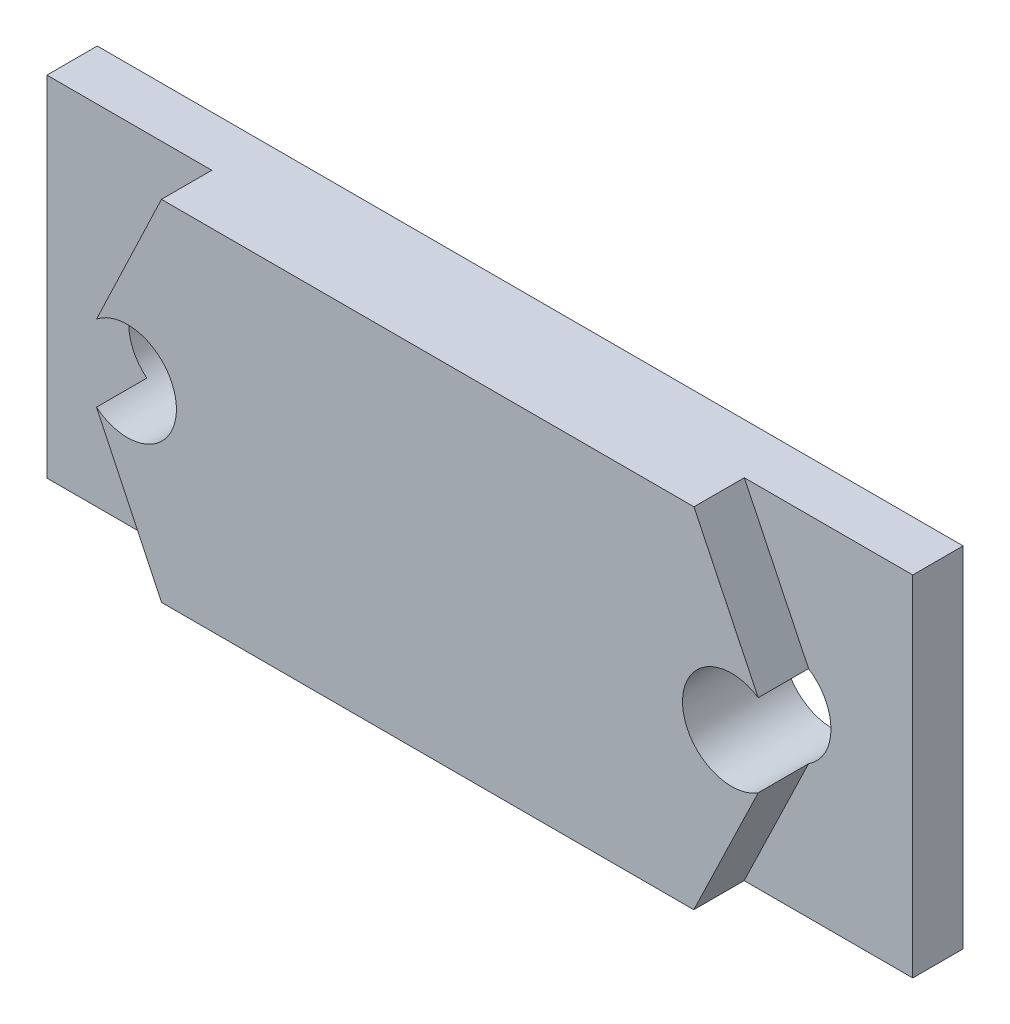
ISO-10303-21;
HEADER;
FILE_DESCRIPTION(('STEP AP214'),'2;1');
FILE_NAME('part.step','',(''),(''),'','','');
FILE_SCHEMA(('AUTOMOTIVE_DESIGN { 1 0 10303 214 1 1 1 1 }'));
ENDSEC;
DATA;
#1=APPLICATION_CONTEXT('core data for automotive mechanical design processes');
#2=APPLICATION_PROTOCOL_DEFINITION('international standard','automotive_design',2000,#1);
#3=PRODUCT_CONTEXT('',#1,'mechanical');
#4=PRODUCT('Part','Part','',(#3));
#5=PRODUCT_RELATED_PRODUCT_CATEGORY('part','',(#4));
#6=PRODUCT_DEFINITION_FORMATION('','',#4);
#7=PRODUCT_DEFINITION_CONTEXT('part definition',#1,'design');
#8=PRODUCT_DEFINITION('design','',#6,#7);
#9=PRODUCT_DEFINITION_SHAPE('','',#8);
#10=(LENGTH_UNIT() NAMED_UNIT(*) SI_UNIT(.MILLI.,.METRE.));
#11=(NAMED_UNIT(*) PLANE_ANGLE_UNIT() SI_UNIT($,.RADIAN.));
#12=(NAMED_UNIT(*) SI_UNIT($,.STERADIAN.) SOLID_ANGLE_UNIT());
#13=UNCERTAINTY_MEASURE_WITH_UNIT(LENGTH_MEASURE(1.E-05),#10,'distance_accuracy_value','');
#14=(GEOMETRIC_REPRESENTATION_CONTEXT(3) GLOBAL_UNCERTAINTY_ASSIGNED_CONTEXT((#13)) GLOBAL_UNIT_ASSIGNED_CONTEXT((#10,
#11,#12)) REPRESENTATION_CONTEXT('',''));
#15=CARTESIAN_POINT('',(0.,0.,0.));
#16=DIRECTION('',(0.,0.,1.));
#17=DIRECTION('',(1.,0.,0.));
#18=AXIS2_PLACEMENT_3D('',#15,#16,#17);
#19=CARTESIAN_POINT('',(0.,0.,4.));
#20=DIRECTION('',(0.,0.,1.));
#21=DIRECTION('',(1.,0.,0.));
#22=AXIS2_PLACEMENT_3D('',#19,#20,#21);
#23=PLANE('',#22);
#24=DIRECTION('',(-0.430249870045661,0.90270983672811,0.));
#25=VECTOR('',#24,1.);
#26=CARTESIAN_POINT('',(-3.54238485728887,-1.68837267800739,4.));
#27=LINE('',#26,#25);
#28=CARTESIAN_POINT('',(3.98730229226638,-17.4864545151208,4.));
#29=VERTEX_POINT('',#28);
#30=CARTESIAN_POINT('',(1.40149156544535,-12.0611494969678,4.));
#31=VERTEX_POINT('',#30);
#32=EDGE_CURVE('E137',#29,#31,#27,.T.);
#33=ORIENTED_EDGE('',*,*,#32,.F.);
#34=DIRECTION('',(1.,0.,0.));
#35=VECTOR('',#34,1.);
#36=CARTESIAN_POINT('',(31.8244825818999,-17.4864545151208,4.));
#37=LINE('',#36,#35);
#38=CARTESIAN_POINT('',(25.1280965421594,-17.4864545151208,4.));
#39=VERTEX_POINT('',#38);
#40=EDGE_CURVE('E194',#29,#39,#37,.T.);
#41=ORIENTED_EDGE('',*,*,#40,.T.);
#42=DIRECTION('',(0.434589647703484,0.900628579442692,0.));
#43=VECTOR('',#42,1.);
#44=CARTESIAN_POINT('',(27.2264648797984,-13.1378684292305,4.));
#45=LINE('',#44,#43);
#46=CARTESIAN_POINT('',(27.6870654496709,-12.1833357128465,4.));
#47=VERTEX_POINT('',#46);
#48=EDGE_CURVE('E153',#39,#47,#45,.T.);
#49=ORIENTED_EDGE('',*,*,#48,.T.);
#50=CARTESIAN_POINT('',(26.6284491617842,-10.5477749144435,4.));
#51=DIRECTION('',(0.,0.,1.));
#52=DIRECTION('',(1.,0.,0.));
#53=AXIS2_PLACEMENT_3D('',#50,#51,#52);
#54=CIRCLE('',#53,1.9482627056564);
#55=CARTESIAN_POINT('',(27.6870654496709,-8.91221411604058,4.));
#56=VERTEX_POINT('',#55);
#57=EDGE_CURVE('E185',#56,#47,#54,.T.);
#58=ORIENTED_EDGE('',*,*,#57,.F.);
#59=DIRECTION('',(-0.434589647703484,0.900628579442692,0.));
#60=VECTOR('',#59,1.);
#61=CARTESIAN_POINT('',(18.9695853101459,9.1535907089678,4.));
#62=LINE('',#61,#60);
#63=CARTESIAN_POINT('',(25.1342408006518,-3.62182846290349,4.));
#64=VERTEX_POINT('',#63);
#65=EDGE_CURVE('E164',#56,#64,#62,.T.);
#66=ORIENTED_EDGE('',*,*,#65,.T.);
#67=DIRECTION('',(-1.,0.,0.));
#68=VECTOR('',#67,1.);
#69=CARTESIAN_POINT('',(31.8244825818999,-3.62182846290349,4.));
#70=LINE('',#69,#68);
#71=CARTESIAN_POINT('',(3.98123341438483,-3.62182846290349,4.));
#72=VERTEX_POINT('',#71);
#73=EDGE_CURVE('E191',#64,#72,#70,.T.);
#74=ORIENTED_EDGE('',*,*,#73,.T.);
#75=DIRECTION('',(0.430249870045661,0.90270983672811,0.));
#76=VECTOR('',#75,1.);
#77=CARTESIAN_POINT('',(4.65093240499672,-2.21672898801445,4.));
#78=LINE('',#77,#76);
#79=CARTESIAN_POINT('',(1.40149156544535,-9.03440033191925,4.));
#80=VERTEX_POINT('',#79);
#81=EDGE_CURVE('E171',#80,#72,#78,.T.);
#82=ORIENTED_EDGE('',*,*,#81,.F.);
#83=CARTESIAN_POINT('',(2.62844916178418,-10.5477749144435,4.));
#84=DIRECTION('',(0.,0.,1.));
#85=DIRECTION('',(1.,0.,0.));
#86=AXIS2_PLACEMENT_3D('',#83,#84,#85);
#87=CIRCLE('',#86,1.94826270565447);
#88=EDGE_CURVE('E143',#31,#80,#87,.T.);
#89=ORIENTED_EDGE('',*,*,#88,.F.);
#90=EDGE_LOOP('',(#33,#41,#49,#58,#66,#74,#82,#89));
#91=FACE_BOUND('',#90,.T.);
#92=ADVANCED_FACE('F33',(#91),#23,.T.);
#93=CARTESIAN_POINT('',(31.8244825818999,-17.4864545151208,4.));
#94=DIRECTION('',(-1.,0.,0.));
#95=DIRECTION('',(0.,0.,1.));
#96=AXIS2_PLACEMENT_3D('',#93,#94,#95);
#97=PLANE('',#96);
#98=DIRECTION('',(0.,1.,0.));
#99=VECTOR('',#98,1.);
#100=CARTESIAN_POINT('',(31.8244825818999,0.,2.));
#101=LINE('',#100,#99);
#102=CARTESIAN_POINT('',(31.8244825818999,-17.4864545151208,2.));
#103=VERTEX_POINT('',#102);
#104=CARTESIAN_POINT('',(31.8244825818999,-3.62182846290349,2.));
#105=VERTEX_POINT('',#104);
#106=EDGE_CURVE('E159',#103,#105,#101,.T.);
#107=ORIENTED_EDGE('',*,*,#106,.F.);
#108=DIRECTION('',(0.,0.,-1.));
#109=VECTOR('',#108,1.);
#110=CARTESIAN_POINT('',(31.8244825818999,-17.4864545151208,4.));
#111=LINE('',#110,#109);
#112=CARTESIAN_POINT('',(31.8244825818999,-17.4864545151208,0.));
#113=VERTEX_POINT('',#112);
#114=EDGE_CURVE('E198',#103,#113,#111,.T.);
#115=ORIENTED_EDGE('',*,*,#114,.T.);
#116=DIRECTION('',(0.,1.,0.));
#117=VECTOR('',#116,1.);
#118=CARTESIAN_POINT('',(31.8244825818999,-17.4864545151208,0.));
#119=LINE('',#118,#117);
#120=CARTESIAN_POINT('',(31.8244825818999,-3.62182846290349,0.));
#121=VERTEX_POINT('',#120);
#122=EDGE_CURVE('E188',#113,#121,#119,.T.);
#123=ORIENTED_EDGE('',*,*,#122,.T.);
#124=DIRECTION('',(0.,0.,-1.));
#125=VECTOR('',#124,1.);
#126=CARTESIAN_POINT('',(31.8244825818999,-3.62182846290349,4.));
#127=LINE('',#126,#125);
#128=EDGE_CURVE('E11',#105,#121,#127,.T.);
#129=ORIENTED_EDGE('',*,*,#128,.F.);
#130=EDGE_LOOP('',(#107,#115,#123,#129));
#131=FACE_BOUND('',#130,.T.);
#132=ADVANCED_FACE('F35',(#131),#97,.F.);
#133=CARTESIAN_POINT('',(31.8244825818999,-3.62182846290349,4.));
#134=DIRECTION('',(0.,-1.,0.));
#135=DIRECTION('',(0.,0.,-1.));
#136=AXIS2_PLACEMENT_3D('',#133,#134,#135);
#137=PLANE('',#136);
#138=DIRECTION('',(-1.,0.,0.));
#139=VECTOR('',#138,1.);
#140=CARTESIAN_POINT('',(0.,-3.62182846290349,2.));
#141=LINE('',#140,#139);
#142=CARTESIAN_POINT('',(3.98123341438483,-3.62182846290349,2.));
#143=VERTEX_POINT('',#142);
#144=CARTESIAN_POINT('',(-2.56758425833156,-3.62182846290349,2.));
#145=VERTEX_POINT('',#144);
#146=EDGE_CURVE('E130',#143,#145,#141,.T.);
#147=ORIENTED_EDGE('',*,*,#146,.F.);
#148=DIRECTION('',(0.,0.,1.));
#149=VECTOR('',#148,1.);
#150=CARTESIAN_POINT('',(3.98123341438483,-3.62182846290349,2.));
#151=LINE('',#150,#149);
#152=EDGE_CURVE('E128',#143,#72,#151,.T.);
#153=ORIENTED_EDGE('',*,*,#152,.T.);
#154=ORIENTED_EDGE('',*,*,#73,.F.);
#155=DIRECTION('',(0.,0.,1.));
#156=VECTOR('',#155,1.);
#157=CARTESIAN_POINT('',(25.1342408006518,-3.62182846290349,2.));
#158=LINE('',#157,#156);
#159=CARTESIAN_POINT('',(25.1342408006518,-3.62182846290349,2.));
#160=VERTEX_POINT('',#159);
#161=EDGE_CURVE('E169',#160,#64,#158,.T.);
#162=ORIENTED_EDGE('',*,*,#161,.F.);
#163=DIRECTION('',(-1.,0.,0.));
#164=VECTOR('',#163,1.);
#165=CARTESIAN_POINT('',(0.,-3.62182846290349,2.));
#166=LINE('',#165,#164);
#167=EDGE_CURVE('E161',#105,#160,#166,.T.);
#168=ORIENTED_EDGE('',*,*,#167,.F.);
#169=ORIENTED_EDGE('',*,*,#128,.T.);
#170=DIRECTION('',(-1.,0.,0.));
#171=VECTOR('',#170,1.);
#172=CARTESIAN_POINT('',(31.8244825818999,-3.62182846290349,0.));
#173=LINE('',#172,#171);
#174=CARTESIAN_POINT('',(-2.56758425833156,-3.62182846290349,0.));
#175=VERTEX_POINT('',#174);
#176=EDGE_CURVE('E201',#121,#175,#173,.T.);
#177=ORIENTED_EDGE('',*,*,#176,.T.);
#178=DIRECTION('',(0.,0.,-1.));
#179=VECTOR('',#178,1.);
#180=CARTESIAN_POINT('',(-2.56758425833156,-3.62182846290349,4.));
#181=LINE('',#180,#179);
#182=EDGE_CURVE('E41',#145,#175,#181,.T.);
#183=ORIENTED_EDGE('',*,*,#182,.F.);
#184=EDGE_LOOP('',(#147,#153,#154,#162,#168,#169,#177,#183));
#185=FACE_BOUND('',#184,.T.);
#186=ADVANCED_FACE('F221',(#185),#137,.F.);
#187=CARTESIAN_POINT('',(-2.56758425833156,-17.4864545151208,4.));
#188=DIRECTION('',(1.,0.,0.));
#189=DIRECTION('',(0.,0.,-1.));
#190=AXIS2_PLACEMENT_3D('',#187,#188,#189);
#191=PLANE('',#190);
#192=DIRECTION('',(0.,-1.,0.));
#193=VECTOR('',#192,1.);
#194=CARTESIAN_POINT('',(-2.56758425833156,0.,2.));
#195=LINE('',#194,#193);
#196=CARTESIAN_POINT('',(-2.56758425833156,-17.4864545151208,2.));
#197=VERTEX_POINT('',#196);
#198=EDGE_CURVE('E218',#145,#197,#195,.T.);
#199=ORIENTED_EDGE('',*,*,#198,.F.);
#200=ORIENTED_EDGE('',*,*,#182,.T.);
#201=DIRECTION('',(0.,-1.,0.));
#202=VECTOR('',#201,1.);
#203=CARTESIAN_POINT('',(-2.56758425833156,-17.4864545151208,0.));
#204=LINE('',#203,#202);
#205=CARTESIAN_POINT('',(-2.56758425833156,-17.4864545151208,0.));
#206=VERTEX_POINT('',#205);
#207=EDGE_CURVE('E204',#175,#206,#204,.T.);
#208=ORIENTED_EDGE('',*,*,#207,.T.);
#209=DIRECTION('',(0.,0.,-1.));
#210=VECTOR('',#209,1.);
#211=CARTESIAN_POINT('',(-2.56758425833156,-17.4864545151208,4.));
#212=LINE('',#211,#210);
#213=EDGE_CURVE('E210',#197,#206,#212,.T.);
#214=ORIENTED_EDGE('',*,*,#213,.F.);
#215=EDGE_LOOP('',(#199,#200,#208,#214));
#216=FACE_BOUND('',#215,.T.);
#217=ADVANCED_FACE('F214',(#216),#191,.F.);
#218=CARTESIAN_POINT('',(31.8244825818999,-17.4864545151208,4.));
#219=DIRECTION('',(0.,1.,0.));
#220=DIRECTION('',(0.,0.,1.));
#221=AXIS2_PLACEMENT_3D('',#218,#219,#220);
#222=PLANE('',#221);
#223=ORIENTED_EDGE('',*,*,#40,.F.);
#224=DIRECTION('',(0.,0.,1.));
#225=VECTOR('',#224,1.);
#226=CARTESIAN_POINT('',(3.98730229226638,-17.4864545151208,2.));
#227=LINE('',#226,#225);
#228=CARTESIAN_POINT('',(3.98730229226638,-17.4864545151208,2.));
#229=VERTEX_POINT('',#228);
#230=EDGE_CURVE('E145',#229,#29,#227,.T.);
#231=ORIENTED_EDGE('',*,*,#230,.F.);
#232=DIRECTION('',(1.,0.,0.));
#233=VECTOR('',#232,1.);
#234=CARTESIAN_POINT('',(0.,-17.4864545151208,2.));
#235=LINE('',#234,#233);
#236=EDGE_CURVE('E147',#197,#229,#235,.T.);
#237=ORIENTED_EDGE('',*,*,#236,.F.);
#238=ORIENTED_EDGE('',*,*,#213,.T.);
#239=DIRECTION('',(1.,0.,0.));
#240=VECTOR('',#239,1.);
#241=CARTESIAN_POINT('',(31.8244825818999,-17.4864545151208,0.));
#242=LINE('',#241,#240);
#243=EDGE_CURVE('E195',#206,#113,#242,.T.);
#244=ORIENTED_EDGE('',*,*,#243,.T.);
#245=ORIENTED_EDGE('',*,*,#114,.F.);
#246=DIRECTION('',(1.,0.,0.));
#247=VECTOR('',#246,1.);
#248=CARTESIAN_POINT('',(0.,-17.4864545151208,2.));
#249=LINE('',#248,#247);
#250=CARTESIAN_POINT('',(25.1280965421594,-17.4864545151208,2.));
#251=VERTEX_POINT('',#250);
#252=EDGE_CURVE('E157',#251,#103,#249,.T.);
#253=ORIENTED_EDGE('',*,*,#252,.F.);
#254=DIRECTION('',(0.,0.,1.));
#255=VECTOR('',#254,1.);
#256=CARTESIAN_POINT('',(25.1280965421594,-17.4864545151208,2.));
#257=LINE('',#256,#255);
#258=EDGE_CURVE('E172',#251,#39,#257,.T.);
#259=ORIENTED_EDGE('',*,*,#258,.T.);
#260=EDGE_LOOP('',(#223,#231,#237,#238,#244,#245,#253,#259));
#261=FACE_BOUND('',#260,.T.);
#262=ADVANCED_FACE('F231',(#261),#222,.F.);
#263=CARTESIAN_POINT('',(26.6284491617842,-10.5477749144435,4.));
#264=DIRECTION('',(0.,0.,-1.));
#265=DIRECTION('',(-1.,0.,0.));
#266=AXIS2_PLACEMENT_3D('',#263,#264,#265);
#267=CYLINDRICAL_SURFACE('',#266,1.9482627056564);
#268=CARTESIAN_POINT('',(26.6284491617842,-10.5477749144435,0.));
#269=DIRECTION('',(0.,0.,1.));
#270=DIRECTION('',(1.,0.,0.));
#271=AXIS2_PLACEMENT_3D('',#268,#269,#270);
#272=CIRCLE('',#271,1.9482627056564);
#273=CARTESIAN_POINT('',(28.5767118674406,-10.5477749144435,0.));
#274=VERTEX_POINT('',#273);
#275=EDGE_CURVE('E180',#274,#274,#272,.T.);
#276=ORIENTED_EDGE('',*,*,#275,.F.);
#277=EDGE_LOOP('',(#276));
#278=FACE_BOUND('',#277,.T.);
#279=CARTESIAN_POINT('',(26.6284491617842,-10.5477749144435,2.));
#280=DIRECTION('',(0.,0.,1.));
#281=DIRECTION('',(1.,0.,0.));
#282=AXIS2_PLACEMENT_3D('',#279,#280,#281);
#283=CIRCLE('',#282,1.9482627056564);
#284=CARTESIAN_POINT('',(27.6870654496709,-8.91221411604058,2.));
#285=VERTEX_POINT('',#284);
#286=CARTESIAN_POINT('',(27.6870654496709,-12.1833357128465,2.));
#287=VERTEX_POINT('',#286);
#288=EDGE_CURVE('E152',#285,#287,#283,.F.);
#289=ORIENTED_EDGE('',*,*,#288,.F.);
#290=DIRECTION('',(0.,0.,1.));
#291=VECTOR('',#290,1.);
#292=CARTESIAN_POINT('',(27.6870654496709,-8.91221411604058,2.));
#293=LINE('',#292,#291);
#294=EDGE_CURVE('E163',#285,#56,#293,.T.);
#295=ORIENTED_EDGE('',*,*,#294,.T.);
#296=ORIENTED_EDGE('',*,*,#57,.T.);
#297=DIRECTION('',(0.,0.,1.));
#298=VECTOR('',#297,1.);
#299=CARTESIAN_POINT('',(27.6870654496709,-12.1833357128465,2.));
#300=LINE('',#299,#298);
#301=EDGE_CURVE('E175',#287,#47,#300,.T.);
#302=ORIENTED_EDGE('',*,*,#301,.F.);
#303=EDGE_LOOP('',(#289,#295,#296,#302));
#304=FACE_BOUND('',#303,.T.);
#305=ADVANCED_FACE('F253',(#278,#304),#267,.F.);
#306=CARTESIAN_POINT('',(0.,0.,0.));
#307=DIRECTION('',(0.,0.,1.));
#308=DIRECTION('',(1.,0.,0.));
#309=AXIS2_PLACEMENT_3D('',#306,#307,#308);
#310=PLANE('',#309);
#311=ORIENTED_EDGE('',*,*,#122,.F.);
#312=ORIENTED_EDGE('',*,*,#243,.F.);
#313=ORIENTED_EDGE('',*,*,#207,.F.);
#314=ORIENTED_EDGE('',*,*,#176,.F.);
#315=EDGE_LOOP('',(#311,#312,#313,#314));
#316=FACE_BOUND('',#315,.T.);
#317=ORIENTED_EDGE('',*,*,#275,.T.);
#318=EDGE_LOOP('',(#317));
#319=FACE_BOUND('',#318,.T.);
#320=CARTESIAN_POINT('',(2.62844916178418,-10.5477749144435,0.));
#321=DIRECTION('',(0.,0.,1.));
#322=DIRECTION('',(1.,0.,0.));
#323=AXIS2_PLACEMENT_3D('',#320,#321,#322);
#324=CIRCLE('',#323,1.94826270565447);
#325=CARTESIAN_POINT('',(4.57671186743866,-10.5477749144435,0.));
#326=VERTEX_POINT('',#325);
#327=EDGE_CURVE('E181',#326,#326,#324,.T.);
#328=ORIENTED_EDGE('',*,*,#327,.T.);
#329=EDGE_LOOP('',(#328));
#330=FACE_BOUND('',#329,.T.);
#331=ADVANCED_FACE('F226',(#316,#319,#330),#310,.F.);
#332=CARTESIAN_POINT('',(2.62844916178418,-10.5477749144435,4.));
#333=DIRECTION('',(0.,0.,-1.));
#334=DIRECTION('',(-1.,0.,0.));
#335=AXIS2_PLACEMENT_3D('',#332,#333,#334);
#336=CYLINDRICAL_SURFACE('',#335,1.94826270565447);
#337=DIRECTION('',(0.,0.,1.));
#338=VECTOR('',#337,1.);
#339=CARTESIAN_POINT('',(1.40149156544535,-12.0611494969678,2.));
#340=LINE('',#339,#338);
#341=CARTESIAN_POINT('',(1.40149156544535,-12.0611494969678,2.));
#342=VERTEX_POINT('',#341);
#343=EDGE_CURVE('E184',#342,#31,#340,.T.);
#344=ORIENTED_EDGE('',*,*,#343,.T.);
#345=ORIENTED_EDGE('',*,*,#88,.T.);
#346=DIRECTION('',(0.,0.,1.));
#347=VECTOR('',#346,1.);
#348=CARTESIAN_POINT('',(1.40149156544535,-9.03440033191925,2.));
#349=LINE('',#348,#347);
#350=CARTESIAN_POINT('',(1.40149156544535,-9.03440033191925,2.));
#351=VERTEX_POINT('',#350);
#352=EDGE_CURVE('E125',#351,#80,#349,.T.);
#353=ORIENTED_EDGE('',*,*,#352,.F.);
#354=CARTESIAN_POINT('',(2.62844916178418,-10.5477749144435,2.));
#355=DIRECTION('',(0.,0.,1.));
#356=DIRECTION('',(1.,0.,0.));
#357=AXIS2_PLACEMENT_3D('',#354,#355,#356);
#358=CIRCLE('',#357,1.94826270565447);
#359=EDGE_CURVE('E131',#342,#351,#358,.F.);
#360=ORIENTED_EDGE('',*,*,#359,.F.);
#361=EDGE_LOOP('',(#344,#345,#353,#360));
#362=FACE_BOUND('',#361,.T.);
#363=ORIENTED_EDGE('',*,*,#327,.F.);
#364=EDGE_LOOP('',(#363));
#365=FACE_BOUND('',#364,.T.);
#366=ADVANCED_FACE('F140',(#362,#365),#336,.F.);
#367=CARTESIAN_POINT('',(-3.54238485728887,-1.68837267800739,2.));
#368=DIRECTION('',(0.90270983672811,0.430249870045661,0.));
#369=DIRECTION('',(-0.430249870045661,0.90270983672811,0.));
#370=AXIS2_PLACEMENT_3D('',#367,#368,#369);
#371=PLANE('',#370);
#372=ORIENTED_EDGE('',*,*,#32,.T.);
#373=ORIENTED_EDGE('',*,*,#343,.F.);
#374=DIRECTION('',(-0.430249870045661,0.90270983672811,0.));
#375=VECTOR('',#374,1.);
#376=CARTESIAN_POINT('',(-3.54238485728887,-1.68837267800739,2.));
#377=LINE('',#376,#375);
#378=EDGE_CURVE('E56',#229,#342,#377,.T.);
#379=ORIENTED_EDGE('',*,*,#378,.F.);
#380=ORIENTED_EDGE('',*,*,#230,.T.);
#381=EDGE_LOOP('',(#372,#373,#379,#380));
#382=FACE_BOUND('',#381,.T.);
#383=ADVANCED_FACE('F243',(#382),#371,.F.);
#384=CARTESIAN_POINT('',(4.65093240499672,-2.21672898801445,2.));
#385=DIRECTION('',(0.90270983672811,-0.430249870045661,0.));
#386=DIRECTION('',(0.430249870045661,0.90270983672811,0.));
#387=AXIS2_PLACEMENT_3D('',#384,#385,#386);
#388=PLANE('',#387);
#389=ORIENTED_EDGE('',*,*,#81,.T.);
#390=ORIENTED_EDGE('',*,*,#152,.F.);
#391=DIRECTION('',(0.430249870045661,0.90270983672811,0.));
#392=VECTOR('',#391,1.);
#393=CARTESIAN_POINT('',(4.65093240499672,-2.21672898801445,2.));
#394=LINE('',#393,#392);
#395=EDGE_CURVE('E122',#351,#143,#394,.T.);
#396=ORIENTED_EDGE('',*,*,#395,.F.);
#397=ORIENTED_EDGE('',*,*,#352,.T.);
#398=EDGE_LOOP('',(#389,#390,#396,#397));
#399=FACE_BOUND('',#398,.T.);
#400=ADVANCED_FACE('F123',(#399),#388,.F.);
#401=CARTESIAN_POINT('',(0.,0.,2.));
#402=DIRECTION('',(0.,0.,1.));
#403=DIRECTION('',(1.,0.,0.));
#404=AXIS2_PLACEMENT_3D('',#401,#402,#403);
#405=PLANE('',#404);
#406=ORIENTED_EDGE('',*,*,#359,.T.);
#407=ORIENTED_EDGE('',*,*,#395,.T.);
#408=ORIENTED_EDGE('',*,*,#146,.T.);
#409=ORIENTED_EDGE('',*,*,#198,.T.);
#410=ORIENTED_EDGE('',*,*,#236,.T.);
#411=ORIENTED_EDGE('',*,*,#378,.T.);
#412=EDGE_LOOP('',(#406,#407,#408,#409,#410,#411));
#413=FACE_BOUND('',#412,.T.);
#414=ADVANCED_FACE('F134',(#413),#405,.T.);
#415=CARTESIAN_POINT('',(18.9695853101459,9.1535907089678,2.));
#416=DIRECTION('',(0.900628579442692,0.434589647703484,0.));
#417=DIRECTION('',(-0.434589647703484,0.900628579442692,0.));
#418=AXIS2_PLACEMENT_3D('',#415,#416,#417);
#419=PLANE('',#418);
#420=ORIENTED_EDGE('',*,*,#65,.F.);
#421=ORIENTED_EDGE('',*,*,#294,.F.);
#422=DIRECTION('',(-0.434589647703484,0.900628579442692,0.));
#423=VECTOR('',#422,1.);
#424=CARTESIAN_POINT('',(18.9695853101459,9.1535907089678,2.));
#425=LINE('',#424,#423);
#426=EDGE_CURVE('E48',#285,#160,#425,.T.);
#427=ORIENTED_EDGE('',*,*,#426,.T.);
#428=ORIENTED_EDGE('',*,*,#161,.T.);
#429=EDGE_LOOP('',(#420,#421,#427,#428));
#430=FACE_BOUND('',#429,.T.);
#431=ADVANCED_FACE('F258',(#430),#419,.T.);
#432=CARTESIAN_POINT('',(27.2264648797984,-13.1378684292305,2.));
#433=DIRECTION('',(0.900628579442692,-0.434589647703484,0.));
#434=DIRECTION('',(0.434589647703484,0.900628579442692,0.));
#435=AXIS2_PLACEMENT_3D('',#432,#433,#434);
#436=PLANE('',#435);
#437=ORIENTED_EDGE('',*,*,#48,.F.);
#438=ORIENTED_EDGE('',*,*,#258,.F.);
#439=DIRECTION('',(0.434589647703484,0.900628579442692,0.));
#440=VECTOR('',#439,1.);
#441=CARTESIAN_POINT('',(27.2264648797984,-13.1378684292305,2.));
#442=LINE('',#441,#440);
#443=EDGE_CURVE('E155',#251,#287,#442,.T.);
#444=ORIENTED_EDGE('',*,*,#443,.T.);
#445=ORIENTED_EDGE('',*,*,#301,.T.);
#446=EDGE_LOOP('',(#437,#438,#444,#445));
#447=FACE_BOUND('',#446,.T.);
#448=ADVANCED_FACE('F247',(#447),#436,.T.);
#449=CARTESIAN_POINT('',(0.,0.,2.));
#450=DIRECTION('',(0.,0.,1.));
#451=DIRECTION('',(1.,0.,0.));
#452=AXIS2_PLACEMENT_3D('',#449,#450,#451);
#453=PLANE('',#452);
#454=ORIENTED_EDGE('',*,*,#426,.F.);
#455=ORIENTED_EDGE('',*,*,#288,.T.);
#456=ORIENTED_EDGE('',*,*,#443,.F.);
#457=ORIENTED_EDGE('',*,*,#252,.T.);
#458=ORIENTED_EDGE('',*,*,#106,.T.);
#459=ORIENTED_EDGE('',*,*,#167,.T.);
#460=EDGE_LOOP('',(#454,#455,#456,#457,#458,#459));
#461=FACE_BOUND('',#460,.T.);
#462=ADVANCED_FACE('F248',(#461),#453,.T.);
#463=CLOSED_SHELL('',(#92,#132,#186,#217,#262,#305,#331,#366,#383,#400,#414,#431,#448,#462));
#464=MANIFOLD_SOLID_BREP('B2',#463);
#465=ADVANCED_BREP_SHAPE_REPRESENTATION('',(#18,#464),#14);
#466=SHAPE_DEFINITION_REPRESENTATION(#9,#465);
ENDSEC;
END-ISO-10303-21;
